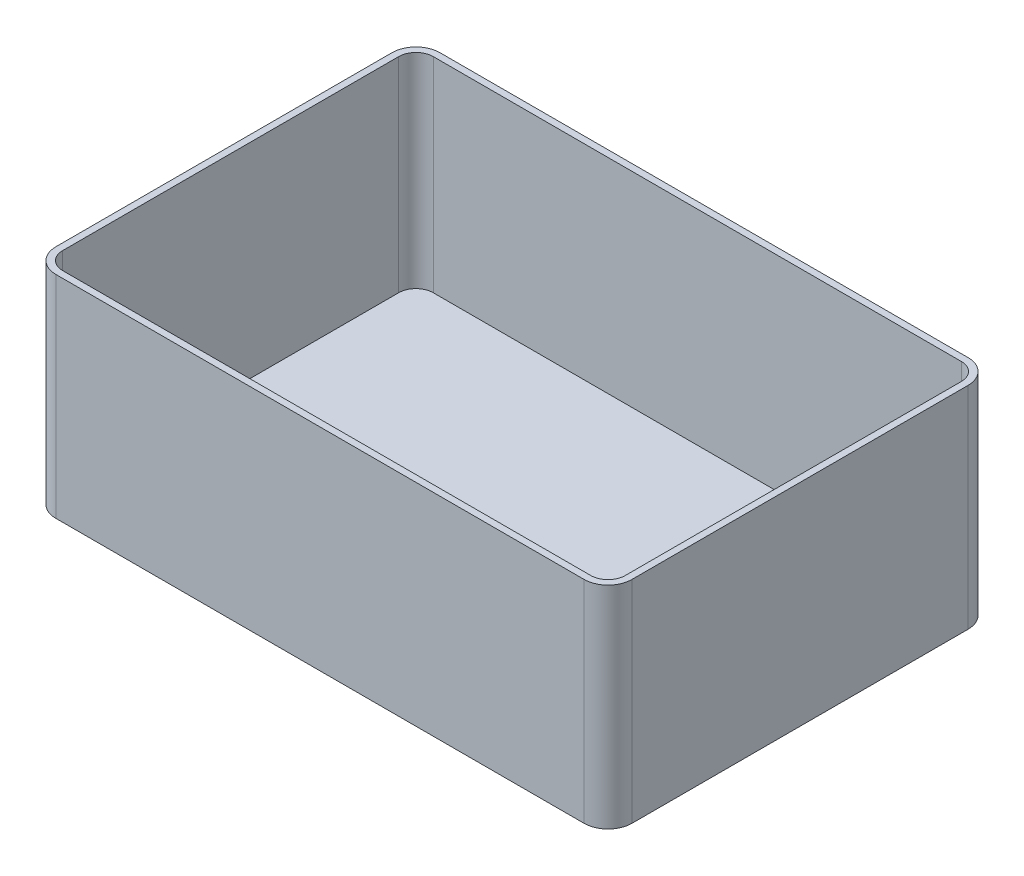
ISO-10303-21;
HEADER;
FILE_DESCRIPTION(('STEP AP214'),'2;1');
FILE_NAME('part.step','',(''),(''),'','','');
FILE_SCHEMA(('AUTOMOTIVE_DESIGN { 1 0 10303 214 1 1 1 1 }'));
ENDSEC;
DATA;
#1=APPLICATION_CONTEXT('core data for automotive mechanical design processes');
#2=APPLICATION_PROTOCOL_DEFINITION('international standard','automotive_design',2000,#1);
#3=PRODUCT_CONTEXT('',#1,'mechanical');
#4=PRODUCT('Part','Part','',(#3));
#5=PRODUCT_RELATED_PRODUCT_CATEGORY('part','',(#4));
#6=PRODUCT_DEFINITION_FORMATION('','',#4);
#7=PRODUCT_DEFINITION_CONTEXT('part definition',#1,'design');
#8=PRODUCT_DEFINITION('design','',#6,#7);
#9=PRODUCT_DEFINITION_SHAPE('','',#8);
#10=(LENGTH_UNIT() NAMED_UNIT(*) SI_UNIT(.MILLI.,.METRE.));
#11=(NAMED_UNIT(*) PLANE_ANGLE_UNIT() SI_UNIT($,.RADIAN.));
#12=(NAMED_UNIT(*) SI_UNIT($,.STERADIAN.) SOLID_ANGLE_UNIT());
#13=UNCERTAINTY_MEASURE_WITH_UNIT(LENGTH_MEASURE(1.E-05),#10,'distance_accuracy_value','');
#14=(GEOMETRIC_REPRESENTATION_CONTEXT(3) GLOBAL_UNCERTAINTY_ASSIGNED_CONTEXT((#13)) GLOBAL_UNIT_ASSIGNED_CONTEXT((#10,
#11,#12)) REPRESENTATION_CONTEXT('',''));
#15=CARTESIAN_POINT('',(0.,0.,0.));
#16=DIRECTION('',(0.,0.,1.));
#17=DIRECTION('',(1.,0.,0.));
#18=AXIS2_PLACEMENT_3D('',#15,#16,#17);
#19=CARTESIAN_POINT('',(275.,220.,-175.));
#20=DIRECTION('',(0.,-1.,0.));
#21=DIRECTION('',(0.,0.,-1.));
#22=AXIS2_PLACEMENT_3D('',#19,#20,#21);
#23=PLANE('',#22);
#24=CARTESIAN_POINT('',(275.,220.,-175.));
#25=DIRECTION('',(0.,1.,0.));
#26=DIRECTION('',(0.,0.,-1.));
#27=AXIS2_PLACEMENT_3D('',#24,#25,#26);
#28=CIRCLE('',#27,25.);
#29=CARTESIAN_POINT('',(300.,220.,-175.));
#30=VERTEX_POINT('',#29);
#31=CARTESIAN_POINT('',(275.,220.,-200.));
#32=VERTEX_POINT('',#31);
#33=EDGE_CURVE('E161',#30,#32,#28,.T.);
#34=ORIENTED_EDGE('',*,*,#33,.T.);
#35=DIRECTION('',(-1.,0.,0.));
#36=VECTOR('',#35,1.);
#37=CARTESIAN_POINT('',(-275.,220.,-200.));
#38=LINE('',#37,#36);
#39=CARTESIAN_POINT('',(-275.,220.,-200.));
#40=VERTEX_POINT('',#39);
#41=EDGE_CURVE('E102',#32,#40,#38,.T.);
#42=ORIENTED_EDGE('',*,*,#41,.T.);
#43=CARTESIAN_POINT('',(-275.,220.,-175.));
#44=DIRECTION('',(0.,1.,0.));
#45=DIRECTION('',(0.,0.,-1.));
#46=AXIS2_PLACEMENT_3D('',#43,#44,#45);
#47=CIRCLE('',#46,25.);
#48=CARTESIAN_POINT('',(-300.,220.,-175.));
#49=VERTEX_POINT('',#48);
#50=EDGE_CURVE('E176',#40,#49,#47,.T.);
#51=ORIENTED_EDGE('',*,*,#50,.T.);
#52=DIRECTION('',(0.,0.,1.));
#53=VECTOR('',#52,1.);
#54=CARTESIAN_POINT('',(-300.,220.,175.));
#55=LINE('',#54,#53);
#56=CARTESIAN_POINT('',(-300.,220.,175.));
#57=VERTEX_POINT('',#56);
#58=EDGE_CURVE('E188',#49,#57,#55,.T.);
#59=ORIENTED_EDGE('',*,*,#58,.T.);
#60=CARTESIAN_POINT('',(-275.,220.,175.));
#61=DIRECTION('',(0.,1.,0.));
#62=DIRECTION('',(0.,0.,-1.));
#63=AXIS2_PLACEMENT_3D('',#60,#61,#62);
#64=CIRCLE('',#63,25.);
#65=CARTESIAN_POINT('',(-275.,220.,200.));
#66=VERTEX_POINT('',#65);
#67=EDGE_CURVE('E124',#57,#66,#64,.T.);
#68=ORIENTED_EDGE('',*,*,#67,.T.);
#69=DIRECTION('',(1.,0.,0.));
#70=VECTOR('',#69,1.);
#71=CARTESIAN_POINT('',(-275.,220.,200.));
#72=LINE('',#71,#70);
#73=CARTESIAN_POINT('',(275.,220.,200.));
#74=VERTEX_POINT('',#73);
#75=EDGE_CURVE('E117',#66,#74,#72,.T.);
#76=ORIENTED_EDGE('',*,*,#75,.T.);
#77=CARTESIAN_POINT('',(275.,220.,175.));
#78=DIRECTION('',(0.,1.,0.));
#79=DIRECTION('',(0.,0.,1.));
#80=AXIS2_PLACEMENT_3D('',#77,#78,#79);
#81=CIRCLE('',#80,25.);
#82=CARTESIAN_POINT('',(300.,220.,175.));
#83=VERTEX_POINT('',#82);
#84=EDGE_CURVE('E121',#74,#83,#81,.T.);
#85=ORIENTED_EDGE('',*,*,#84,.T.);
#86=DIRECTION('',(0.,0.,-1.));
#87=VECTOR('',#86,1.);
#88=CARTESIAN_POINT('',(300.,220.,175.));
#89=LINE('',#88,#87);
#90=EDGE_CURVE('E61',#83,#30,#89,.T.);
#91=ORIENTED_EDGE('',*,*,#90,.T.);
#92=EDGE_LOOP('',(#34,#42,#51,#59,#68,#76,#85,#91));
#93=FACE_BOUND('',#92,.T.);
#94=CARTESIAN_POINT('',(275.,220.,-175.));
#95=DIRECTION('',(0.,-1.,0.));
#96=DIRECTION('',(0.,0.,-1.));
#97=AXIS2_PLACEMENT_3D('',#94,#95,#96);
#98=CIRCLE('',#97,18.);
#99=CARTESIAN_POINT('',(293.,220.,-175.));
#100=VERTEX_POINT('',#99);
#101=CARTESIAN_POINT('',(275.,220.,-193.));
#102=VERTEX_POINT('',#101);
#103=EDGE_CURVE('E214',#100,#102,#98,.F.);
#104=ORIENTED_EDGE('',*,*,#103,.F.);
#105=DIRECTION('',(0.,0.,-1.));
#106=VECTOR('',#105,1.);
#107=CARTESIAN_POINT('',(293.,220.,-175.));
#108=LINE('',#107,#106);
#109=CARTESIAN_POINT('',(293.,220.,175.));
#110=VERTEX_POINT('',#109);
#111=EDGE_CURVE('E194',#110,#100,#108,.T.);
#112=ORIENTED_EDGE('',*,*,#111,.F.);
#113=CARTESIAN_POINT('',(275.,220.,175.));
#114=DIRECTION('',(0.,-1.,0.));
#115=DIRECTION('',(0.,0.,-1.));
#116=AXIS2_PLACEMENT_3D('',#113,#114,#115);
#117=CIRCLE('',#116,18.);
#118=CARTESIAN_POINT('',(275.,220.,193.));
#119=VERTEX_POINT('',#118);
#120=EDGE_CURVE('E197',#119,#110,#117,.F.);
#121=ORIENTED_EDGE('',*,*,#120,.F.);
#122=DIRECTION('',(1.,0.,0.));
#123=VECTOR('',#122,1.);
#124=CARTESIAN_POINT('',(275.,220.,193.));
#125=LINE('',#124,#123);
#126=CARTESIAN_POINT('',(-275.,220.,193.));
#127=VERTEX_POINT('',#126);
#128=EDGE_CURVE('E199',#127,#119,#125,.T.);
#129=ORIENTED_EDGE('',*,*,#128,.F.);
#130=CARTESIAN_POINT('',(-275.,220.,175.));
#131=DIRECTION('',(0.,-1.,0.));
#132=DIRECTION('',(0.,0.,-1.));
#133=AXIS2_PLACEMENT_3D('',#130,#131,#132);
#134=CIRCLE('',#133,18.);
#135=CARTESIAN_POINT('',(-293.,220.,175.));
#136=VERTEX_POINT('',#135);
#137=EDGE_CURVE('E202',#136,#127,#134,.F.);
#138=ORIENTED_EDGE('',*,*,#137,.F.);
#139=DIRECTION('',(0.,0.,1.));
#140=VECTOR('',#139,1.);
#141=CARTESIAN_POINT('',(-293.,220.,-175.));
#142=LINE('',#141,#140);
#143=CARTESIAN_POINT('',(-293.,220.,-175.));
#144=VERTEX_POINT('',#143);
#145=EDGE_CURVE('E205',#144,#136,#142,.T.);
#146=ORIENTED_EDGE('',*,*,#145,.F.);
#147=CARTESIAN_POINT('',(-275.,220.,-175.));
#148=DIRECTION('',(0.,-1.,0.));
#149=DIRECTION('',(0.,0.,-1.));
#150=AXIS2_PLACEMENT_3D('',#147,#148,#149);
#151=CIRCLE('',#150,18.);
#152=CARTESIAN_POINT('',(-275.,220.,-193.));
#153=VERTEX_POINT('',#152);
#154=EDGE_CURVE('E208',#153,#144,#151,.F.);
#155=ORIENTED_EDGE('',*,*,#154,.F.);
#156=DIRECTION('',(-1.,0.,0.));
#157=VECTOR('',#156,1.);
#158=CARTESIAN_POINT('',(275.,220.,-193.));
#159=LINE('',#158,#157);
#160=EDGE_CURVE('E211',#102,#153,#159,.T.);
#161=ORIENTED_EDGE('',*,*,#160,.F.);
#162=EDGE_LOOP('',(#104,#112,#121,#129,#138,#146,#155,#161));
#163=FACE_BOUND('',#162,.T.);
#164=ADVANCED_FACE('F37',(#93,#163),#23,.F.);
#165=CARTESIAN_POINT('',(275.,220.,-175.));
#166=DIRECTION('',(0.,-1.,0.));
#167=DIRECTION('',(0.,0.,-1.));
#168=AXIS2_PLACEMENT_3D('',#165,#166,#167);
#169=CYLINDRICAL_SURFACE('',#168,25.);
#170=CARTESIAN_POINT('',(275.,0.,-175.));
#171=DIRECTION('',(0.,1.,0.));
#172=DIRECTION('',(0.,0.,-1.));
#173=AXIS2_PLACEMENT_3D('',#170,#171,#172);
#174=CIRCLE('',#173,25.);
#175=CARTESIAN_POINT('',(300.,0.,-175.));
#176=VERTEX_POINT('',#175);
#177=CARTESIAN_POINT('',(275.,0.,-200.));
#178=VERTEX_POINT('',#177);
#179=EDGE_CURVE('E145',#176,#178,#174,.T.);
#180=ORIENTED_EDGE('',*,*,#179,.T.);
#181=DIRECTION('',(0.,-1.,0.));
#182=VECTOR('',#181,1.);
#183=CARTESIAN_POINT('',(275.,220.,-200.));
#184=LINE('',#183,#182);
#185=EDGE_CURVE('E11',#32,#178,#184,.T.);
#186=ORIENTED_EDGE('',*,*,#185,.F.);
#187=ORIENTED_EDGE('',*,*,#33,.F.);
#188=DIRECTION('',(0.,-1.,0.));
#189=VECTOR('',#188,1.);
#190=CARTESIAN_POINT('',(300.,220.,-175.));
#191=LINE('',#190,#189);
#192=EDGE_CURVE('E141',#30,#176,#191,.T.);
#193=ORIENTED_EDGE('',*,*,#192,.T.);
#194=EDGE_LOOP('',(#180,#186,#187,#193));
#195=FACE_BOUND('',#194,.T.);
#196=ADVANCED_FACE('F39',(#195),#169,.T.);
#197=CARTESIAN_POINT('',(-275.,220.,-200.));
#198=DIRECTION('',(0.,0.,1.));
#199=DIRECTION('',(1.,0.,0.));
#200=AXIS2_PLACEMENT_3D('',#197,#198,#199);
#201=PLANE('',#200);
#202=DIRECTION('',(-1.,0.,0.));
#203=VECTOR('',#202,1.);
#204=CARTESIAN_POINT('',(-275.,0.,-200.));
#205=LINE('',#204,#203);
#206=CARTESIAN_POINT('',(-275.,0.,-200.));
#207=VERTEX_POINT('',#206);
#208=EDGE_CURVE('E148',#178,#207,#205,.T.);
#209=ORIENTED_EDGE('',*,*,#208,.T.);
#210=DIRECTION('',(0.,-1.,0.));
#211=VECTOR('',#210,1.);
#212=CARTESIAN_POINT('',(-275.,220.,-200.));
#213=LINE('',#212,#211);
#214=EDGE_CURVE('E45',#40,#207,#213,.T.);
#215=ORIENTED_EDGE('',*,*,#214,.F.);
#216=ORIENTED_EDGE('',*,*,#41,.F.);
#217=ORIENTED_EDGE('',*,*,#185,.T.);
#218=EDGE_LOOP('',(#209,#215,#216,#217));
#219=FACE_BOUND('',#218,.T.);
#220=ADVANCED_FACE('F333',(#219),#201,.F.);
#221=CARTESIAN_POINT('',(-275.,220.,-175.));
#222=DIRECTION('',(0.,-1.,0.));
#223=DIRECTION('',(0.,0.,-1.));
#224=AXIS2_PLACEMENT_3D('',#221,#222,#223);
#225=CYLINDRICAL_SURFACE('',#224,25.);
#226=CARTESIAN_POINT('',(-275.,0.,-175.));
#227=DIRECTION('',(0.,1.,0.));
#228=DIRECTION('',(0.,0.,-1.));
#229=AXIS2_PLACEMENT_3D('',#226,#227,#228);
#230=CIRCLE('',#229,25.);
#231=CARTESIAN_POINT('',(-300.,0.,-175.));
#232=VERTEX_POINT('',#231);
#233=EDGE_CURVE('E151',#207,#232,#230,.T.);
#234=ORIENTED_EDGE('',*,*,#233,.T.);
#235=DIRECTION('',(0.,-1.,0.));
#236=VECTOR('',#235,1.);
#237=CARTESIAN_POINT('',(-300.,220.,-175.));
#238=LINE('',#237,#236);
#239=EDGE_CURVE('E168',#49,#232,#238,.T.);
#240=ORIENTED_EDGE('',*,*,#239,.F.);
#241=ORIENTED_EDGE('',*,*,#50,.F.);
#242=ORIENTED_EDGE('',*,*,#214,.T.);
#243=EDGE_LOOP('',(#234,#240,#241,#242));
#244=FACE_BOUND('',#243,.T.);
#245=ADVANCED_FACE('F174',(#244),#225,.T.);
#246=CARTESIAN_POINT('',(-300.,220.,175.));
#247=DIRECTION('',(1.,0.,0.));
#248=DIRECTION('',(0.,0.,-1.));
#249=AXIS2_PLACEMENT_3D('',#246,#247,#248);
#250=PLANE('',#249);
#251=DIRECTION('',(0.,0.,1.));
#252=VECTOR('',#251,1.);
#253=CARTESIAN_POINT('',(-300.,0.,175.));
#254=LINE('',#253,#252);
#255=CARTESIAN_POINT('',(-300.,0.,175.));
#256=VERTEX_POINT('',#255);
#257=EDGE_CURVE('E153',#232,#256,#254,.T.);
#258=ORIENTED_EDGE('',*,*,#257,.T.);
#259=DIRECTION('',(0.,-1.,0.));
#260=VECTOR('',#259,1.);
#261=CARTESIAN_POINT('',(-300.,220.,175.));
#262=LINE('',#261,#260);
#263=EDGE_CURVE('E165',#57,#256,#262,.T.);
#264=ORIENTED_EDGE('',*,*,#263,.F.);
#265=ORIENTED_EDGE('',*,*,#58,.F.);
#266=ORIENTED_EDGE('',*,*,#239,.T.);
#267=EDGE_LOOP('',(#258,#264,#265,#266));
#268=FACE_BOUND('',#267,.T.);
#269=ADVANCED_FACE('F184',(#268),#250,.F.);
#270=CARTESIAN_POINT('',(-275.,220.,175.));
#271=DIRECTION('',(0.,-1.,0.));
#272=DIRECTION('',(0.,0.,-1.));
#273=AXIS2_PLACEMENT_3D('',#270,#271,#272);
#274=CYLINDRICAL_SURFACE('',#273,25.);
#275=CARTESIAN_POINT('',(-275.,0.,175.));
#276=DIRECTION('',(0.,1.,0.));
#277=DIRECTION('',(0.,0.,-1.));
#278=AXIS2_PLACEMENT_3D('',#275,#276,#277);
#279=CIRCLE('',#278,25.);
#280=CARTESIAN_POINT('',(-275.,0.,200.));
#281=VERTEX_POINT('',#280);
#282=EDGE_CURVE('E155',#256,#281,#279,.T.);
#283=ORIENTED_EDGE('',*,*,#282,.T.);
#284=DIRECTION('',(0.,-1.,0.));
#285=VECTOR('',#284,1.);
#286=CARTESIAN_POINT('',(-275.,220.,200.));
#287=LINE('',#286,#285);
#288=EDGE_CURVE('E136',#66,#281,#287,.T.);
#289=ORIENTED_EDGE('',*,*,#288,.F.);
#290=ORIENTED_EDGE('',*,*,#67,.F.);
#291=ORIENTED_EDGE('',*,*,#263,.T.);
#292=EDGE_LOOP('',(#283,#289,#290,#291));
#293=FACE_BOUND('',#292,.T.);
#294=ADVANCED_FACE('F187',(#293),#274,.T.);
#295=CARTESIAN_POINT('',(-275.,220.,200.));
#296=DIRECTION('',(0.,0.,-1.));
#297=DIRECTION('',(-1.,0.,0.));
#298=AXIS2_PLACEMENT_3D('',#295,#296,#297);
#299=PLANE('',#298);
#300=DIRECTION('',(1.,0.,0.));
#301=VECTOR('',#300,1.);
#302=CARTESIAN_POINT('',(-275.,0.,200.));
#303=LINE('',#302,#301);
#304=CARTESIAN_POINT('',(275.,0.,200.));
#305=VERTEX_POINT('',#304);
#306=EDGE_CURVE('E133',#281,#305,#303,.T.);
#307=ORIENTED_EDGE('',*,*,#306,.T.);
#308=DIRECTION('',(0.,-1.,0.));
#309=VECTOR('',#308,1.);
#310=CARTESIAN_POINT('',(275.,220.,200.));
#311=LINE('',#310,#309);
#312=EDGE_CURVE('E130',#74,#305,#311,.T.);
#313=ORIENTED_EDGE('',*,*,#312,.F.);
#314=ORIENTED_EDGE('',*,*,#75,.F.);
#315=ORIENTED_EDGE('',*,*,#288,.T.);
#316=EDGE_LOOP('',(#307,#313,#314,#315));
#317=FACE_BOUND('',#316,.T.);
#318=ADVANCED_FACE('F131',(#317),#299,.F.);
#319=CARTESIAN_POINT('',(275.,220.,175.));
#320=DIRECTION('',(0.,-1.,0.));
#321=DIRECTION('',(0.,0.,-1.));
#322=AXIS2_PLACEMENT_3D('',#319,#320,#321);
#323=CYLINDRICAL_SURFACE('',#322,25.);
#324=CARTESIAN_POINT('',(275.,0.,175.));
#325=DIRECTION('',(0.,1.,0.));
#326=DIRECTION('',(0.,0.,1.));
#327=AXIS2_PLACEMENT_3D('',#324,#325,#326);
#328=CIRCLE('',#327,25.);
#329=CARTESIAN_POINT('',(300.,0.,175.));
#330=VERTEX_POINT('',#329);
#331=EDGE_CURVE('E158',#305,#330,#328,.T.);
#332=ORIENTED_EDGE('',*,*,#331,.T.);
#333=DIRECTION('',(0.,-1.,0.));
#334=VECTOR('',#333,1.);
#335=CARTESIAN_POINT('',(300.,220.,175.));
#336=LINE('',#335,#334);
#337=EDGE_CURVE('E137',#83,#330,#336,.T.);
#338=ORIENTED_EDGE('',*,*,#337,.F.);
#339=ORIENTED_EDGE('',*,*,#84,.F.);
#340=ORIENTED_EDGE('',*,*,#312,.T.);
#341=EDGE_LOOP('',(#332,#338,#339,#340));
#342=FACE_BOUND('',#341,.T.);
#343=ADVANCED_FACE('F139',(#342),#323,.T.);
#344=CARTESIAN_POINT('',(300.,220.,175.));
#345=DIRECTION('',(-1.,0.,0.));
#346=DIRECTION('',(0.,0.,1.));
#347=AXIS2_PLACEMENT_3D('',#344,#345,#346);
#348=PLANE('',#347);
#349=DIRECTION('',(0.,0.,-1.));
#350=VECTOR('',#349,1.);
#351=CARTESIAN_POINT('',(300.,0.,175.));
#352=LINE('',#351,#350);
#353=EDGE_CURVE('E94',#330,#176,#352,.T.);
#354=ORIENTED_EDGE('',*,*,#353,.T.);
#355=ORIENTED_EDGE('',*,*,#192,.F.);
#356=ORIENTED_EDGE('',*,*,#90,.F.);
#357=ORIENTED_EDGE('',*,*,#337,.T.);
#358=EDGE_LOOP('',(#354,#355,#356,#357));
#359=FACE_BOUND('',#358,.T.);
#360=ADVANCED_FACE('F339',(#359),#348,.F.);
#361=CARTESIAN_POINT('',(275.,0.,-175.));
#362=DIRECTION('',(0.,-1.,0.));
#363=DIRECTION('',(0.,0.,-1.));
#364=AXIS2_PLACEMENT_3D('',#361,#362,#363);
#365=PLANE('',#364);
#366=ORIENTED_EDGE('',*,*,#179,.F.);
#367=ORIENTED_EDGE('',*,*,#353,.F.);
#368=ORIENTED_EDGE('',*,*,#331,.F.);
#369=ORIENTED_EDGE('',*,*,#306,.F.);
#370=ORIENTED_EDGE('',*,*,#282,.F.);
#371=ORIENTED_EDGE('',*,*,#257,.F.);
#372=ORIENTED_EDGE('',*,*,#233,.F.);
#373=ORIENTED_EDGE('',*,*,#208,.F.);
#374=EDGE_LOOP('',(#366,#367,#368,#369,#370,#371,#372,#373));
#375=FACE_BOUND('',#374,.T.);
#376=ADVANCED_FACE('F180',(#375),#365,.T.);
#377=CARTESIAN_POINT('',(275.,220.,-175.));
#378=DIRECTION('',(0.,-1.,0.));
#379=DIRECTION('',(0.,0.,-1.));
#380=AXIS2_PLACEMENT_3D('',#377,#378,#379);
#381=CYLINDRICAL_SURFACE('',#380,18.);
#382=CARTESIAN_POINT('',(275.,7.00000000000001,-175.));
#383=DIRECTION('',(0.,-1.,0.));
#384=DIRECTION('',(0.,0.,-1.));
#385=AXIS2_PLACEMENT_3D('',#382,#383,#384);
#386=CIRCLE('',#385,18.);
#387=CARTESIAN_POINT('',(293.,7.00000000000001,-175.));
#388=VERTEX_POINT('',#387);
#389=CARTESIAN_POINT('',(275.,7.00000000000001,-193.));
#390=VERTEX_POINT('',#389);
#391=EDGE_CURVE('E254',#388,#390,#386,.F.);
#392=ORIENTED_EDGE('',*,*,#391,.F.);
#393=DIRECTION('',(0.,-1.,0.));
#394=VECTOR('',#393,1.);
#395=CARTESIAN_POINT('',(293.,220.,-175.));
#396=LINE('',#395,#394);
#397=EDGE_CURVE('E196',#100,#388,#396,.T.);
#398=ORIENTED_EDGE('',*,*,#397,.F.);
#399=ORIENTED_EDGE('',*,*,#103,.T.);
#400=DIRECTION('',(0.,1.,0.));
#401=VECTOR('',#400,1.);
#402=CARTESIAN_POINT('',(275.,220.,-193.));
#403=LINE('',#402,#401);
#404=EDGE_CURVE('E149',#102,#390,#403,.F.);
#405=ORIENTED_EDGE('',*,*,#404,.T.);
#406=EDGE_LOOP('',(#392,#398,#399,#405));
#407=FACE_BOUND('',#406,.T.);
#408=ADVANCED_FACE('F270',(#407),#381,.F.);
#409=CARTESIAN_POINT('',(-275.,220.,-193.));
#410=DIRECTION('',(0.,0.,1.));
#411=DIRECTION('',(1.,0.,0.));
#412=AXIS2_PLACEMENT_3D('',#409,#410,#411);
#413=PLANE('',#412);
#414=DIRECTION('',(-1.,0.,0.));
#415=VECTOR('',#414,1.);
#416=CARTESIAN_POINT('',(275.,7.,-193.));
#417=LINE('',#416,#415);
#418=CARTESIAN_POINT('',(-275.,7.00000000000001,-193.));
#419=VERTEX_POINT('',#418);
#420=EDGE_CURVE('E249',#390,#419,#417,.T.);
#421=ORIENTED_EDGE('',*,*,#420,.F.);
#422=ORIENTED_EDGE('',*,*,#404,.F.);
#423=ORIENTED_EDGE('',*,*,#160,.T.);
#424=DIRECTION('',(0.,-1.,0.));
#425=VECTOR('',#424,1.);
#426=CARTESIAN_POINT('',(-275.,220.,-193.));
#427=LINE('',#426,#425);
#428=EDGE_CURVE('E246',#153,#419,#427,.T.);
#429=ORIENTED_EDGE('',*,*,#428,.T.);
#430=EDGE_LOOP('',(#421,#422,#423,#429));
#431=FACE_BOUND('',#430,.T.);
#432=ADVANCED_FACE('F299',(#431),#413,.T.);
#433=CARTESIAN_POINT('',(-275.,220.,-175.));
#434=DIRECTION('',(0.,-1.,0.));
#435=DIRECTION('',(0.,0.,-1.));
#436=AXIS2_PLACEMENT_3D('',#433,#434,#435);
#437=CYLINDRICAL_SURFACE('',#436,18.);
#438=CARTESIAN_POINT('',(-275.,7.00000000000001,-175.));
#439=DIRECTION('',(0.,-1.,0.));
#440=DIRECTION('',(0.,0.,-1.));
#441=AXIS2_PLACEMENT_3D('',#438,#439,#440);
#442=CIRCLE('',#441,18.);
#443=CARTESIAN_POINT('',(-293.,7.00000000000001,-175.));
#444=VERTEX_POINT('',#443);
#445=EDGE_CURVE('E243',#419,#444,#442,.F.);
#446=ORIENTED_EDGE('',*,*,#445,.F.);
#447=ORIENTED_EDGE('',*,*,#428,.F.);
#448=ORIENTED_EDGE('',*,*,#154,.T.);
#449=DIRECTION('',(0.,1.,0.));
#450=VECTOR('',#449,1.);
#451=CARTESIAN_POINT('',(-293.,220.,-175.));
#452=LINE('',#451,#450);
#453=EDGE_CURVE('E240',#144,#444,#452,.F.);
#454=ORIENTED_EDGE('',*,*,#453,.T.);
#455=EDGE_LOOP('',(#446,#447,#448,#454));
#456=FACE_BOUND('',#455,.T.);
#457=ADVANCED_FACE('F305',(#456),#437,.F.);
#458=CARTESIAN_POINT('',(-293.,220.,175.));
#459=DIRECTION('',(1.,0.,0.));
#460=DIRECTION('',(0.,0.,-1.));
#461=AXIS2_PLACEMENT_3D('',#458,#459,#460);
#462=PLANE('',#461);
#463=DIRECTION('',(0.,0.,1.));
#464=VECTOR('',#463,1.);
#465=CARTESIAN_POINT('',(-293.,7.,-175.));
#466=LINE('',#465,#464);
#467=CARTESIAN_POINT('',(-293.,7.00000000000001,175.));
#468=VERTEX_POINT('',#467);
#469=EDGE_CURVE('E237',#444,#468,#466,.T.);
#470=ORIENTED_EDGE('',*,*,#469,.F.);
#471=ORIENTED_EDGE('',*,*,#453,.F.);
#472=ORIENTED_EDGE('',*,*,#145,.T.);
#473=DIRECTION('',(0.,-1.,0.));
#474=VECTOR('',#473,1.);
#475=CARTESIAN_POINT('',(-293.,220.,175.));
#476=LINE('',#475,#474);
#477=EDGE_CURVE('E234',#136,#468,#476,.T.);
#478=ORIENTED_EDGE('',*,*,#477,.T.);
#479=EDGE_LOOP('',(#470,#471,#472,#478));
#480=FACE_BOUND('',#479,.T.);
#481=ADVANCED_FACE('F404',(#480),#462,.T.);
#482=CARTESIAN_POINT('',(-275.,220.,175.));
#483=DIRECTION('',(0.,-1.,0.));
#484=DIRECTION('',(0.,0.,-1.));
#485=AXIS2_PLACEMENT_3D('',#482,#483,#484);
#486=CYLINDRICAL_SURFACE('',#485,18.);
#487=CARTESIAN_POINT('',(-275.,7.00000000000001,175.));
#488=DIRECTION('',(0.,-1.,0.));
#489=DIRECTION('',(0.,0.,-1.));
#490=AXIS2_PLACEMENT_3D('',#487,#488,#489);
#491=CIRCLE('',#490,18.);
#492=CARTESIAN_POINT('',(-275.,7.00000000000001,193.));
#493=VERTEX_POINT('',#492);
#494=EDGE_CURVE('E231',#468,#493,#491,.F.);
#495=ORIENTED_EDGE('',*,*,#494,.F.);
#496=ORIENTED_EDGE('',*,*,#477,.F.);
#497=ORIENTED_EDGE('',*,*,#137,.T.);
#498=DIRECTION('',(0.,1.,0.));
#499=VECTOR('',#498,1.);
#500=CARTESIAN_POINT('',(-275.,220.,193.));
#501=LINE('',#500,#499);
#502=EDGE_CURVE('E228',#127,#493,#501,.F.);
#503=ORIENTED_EDGE('',*,*,#502,.T.);
#504=EDGE_LOOP('',(#495,#496,#497,#503));
#505=FACE_BOUND('',#504,.T.);
#506=ADVANCED_FACE('F326',(#505),#486,.F.);
#507=CARTESIAN_POINT('',(-275.,220.,193.));
#508=DIRECTION('',(0.,0.,-1.));
#509=DIRECTION('',(-1.,0.,0.));
#510=AXIS2_PLACEMENT_3D('',#507,#508,#509);
#511=PLANE('',#510);
#512=DIRECTION('',(1.,0.,0.));
#513=VECTOR('',#512,1.);
#514=CARTESIAN_POINT('',(275.,7.,193.));
#515=LINE('',#514,#513);
#516=CARTESIAN_POINT('',(275.,7.00000000000001,193.));
#517=VERTEX_POINT('',#516);
#518=EDGE_CURVE('E225',#493,#517,#515,.T.);
#519=ORIENTED_EDGE('',*,*,#518,.F.);
#520=ORIENTED_EDGE('',*,*,#502,.F.);
#521=ORIENTED_EDGE('',*,*,#128,.T.);
#522=DIRECTION('',(0.,-1.,0.));
#523=VECTOR('',#522,1.);
#524=CARTESIAN_POINT('',(275.,220.,193.));
#525=LINE('',#524,#523);
#526=EDGE_CURVE('E222',#119,#517,#525,.T.);
#527=ORIENTED_EDGE('',*,*,#526,.T.);
#528=EDGE_LOOP('',(#519,#520,#521,#527));
#529=FACE_BOUND('',#528,.T.);
#530=ADVANCED_FACE('F316',(#529),#511,.T.);
#531=CARTESIAN_POINT('',(275.,220.,175.));
#532=DIRECTION('',(0.,-1.,0.));
#533=DIRECTION('',(0.,0.,-1.));
#534=AXIS2_PLACEMENT_3D('',#531,#532,#533);
#535=CYLINDRICAL_SURFACE('',#534,18.);
#536=CARTESIAN_POINT('',(275.,7.00000000000001,175.));
#537=DIRECTION('',(0.,-1.,0.));
#538=DIRECTION('',(0.,0.,-1.));
#539=AXIS2_PLACEMENT_3D('',#536,#537,#538);
#540=CIRCLE('',#539,18.);
#541=CARTESIAN_POINT('',(293.,7.00000000000001,175.));
#542=VERTEX_POINT('',#541);
#543=EDGE_CURVE('E220',#517,#542,#540,.F.);
#544=ORIENTED_EDGE('',*,*,#543,.F.);
#545=ORIENTED_EDGE('',*,*,#526,.F.);
#546=ORIENTED_EDGE('',*,*,#120,.T.);
#547=DIRECTION('',(0.,1.,0.));
#548=VECTOR('',#547,1.);
#549=CARTESIAN_POINT('',(293.,220.,175.));
#550=LINE('',#549,#548);
#551=EDGE_CURVE('E52',#110,#542,#550,.F.);
#552=ORIENTED_EDGE('',*,*,#551,.T.);
#553=EDGE_LOOP('',(#544,#545,#546,#552));
#554=FACE_BOUND('',#553,.T.);
#555=ADVANCED_FACE('F318',(#554),#535,.F.);
#556=CARTESIAN_POINT('',(293.,220.,175.));
#557=DIRECTION('',(-1.,0.,0.));
#558=DIRECTION('',(0.,0.,1.));
#559=AXIS2_PLACEMENT_3D('',#556,#557,#558);
#560=PLANE('',#559);
#561=DIRECTION('',(0.,0.,-1.));
#562=VECTOR('',#561,1.);
#563=CARTESIAN_POINT('',(293.,7.,-175.));
#564=LINE('',#563,#562);
#565=EDGE_CURVE('E217',#542,#388,#564,.T.);
#566=ORIENTED_EDGE('',*,*,#565,.F.);
#567=ORIENTED_EDGE('',*,*,#551,.F.);
#568=ORIENTED_EDGE('',*,*,#111,.T.);
#569=ORIENTED_EDGE('',*,*,#397,.T.);
#570=EDGE_LOOP('',(#566,#567,#568,#569));
#571=FACE_BOUND('',#570,.T.);
#572=ADVANCED_FACE('F294',(#571),#560,.T.);
#573=CARTESIAN_POINT('',(275.,7.,-175.));
#574=DIRECTION('',(0.,-1.,0.));
#575=DIRECTION('',(0.,0.,-1.));
#576=AXIS2_PLACEMENT_3D('',#573,#574,#575);
#577=PLANE('',#576);
#578=ORIENTED_EDGE('',*,*,#391,.T.);
#579=ORIENTED_EDGE('',*,*,#420,.T.);
#580=ORIENTED_EDGE('',*,*,#445,.T.);
#581=ORIENTED_EDGE('',*,*,#469,.T.);
#582=ORIENTED_EDGE('',*,*,#494,.T.);
#583=ORIENTED_EDGE('',*,*,#518,.T.);
#584=ORIENTED_EDGE('',*,*,#543,.T.);
#585=ORIENTED_EDGE('',*,*,#565,.T.);
#586=EDGE_LOOP('',(#578,#579,#580,#581,#582,#583,#584,#585));
#587=FACE_BOUND('',#586,.T.);
#588=ADVANCED_FACE('F263',(#587),#577,.F.);
#589=CLOSED_SHELL('',(#164,#196,#220,#245,#269,#294,#318,#343,#360,#376,#408,#432,#457,#481,
#506,#530,#555,#572,#588));
#590=MANIFOLD_SOLID_BREP('B2',#589);
#591=ADVANCED_BREP_SHAPE_REPRESENTATION('',(#18,#590),#14);
#592=SHAPE_DEFINITION_REPRESENTATION(#9,#591);
ENDSEC;
END-ISO-10303-21;
